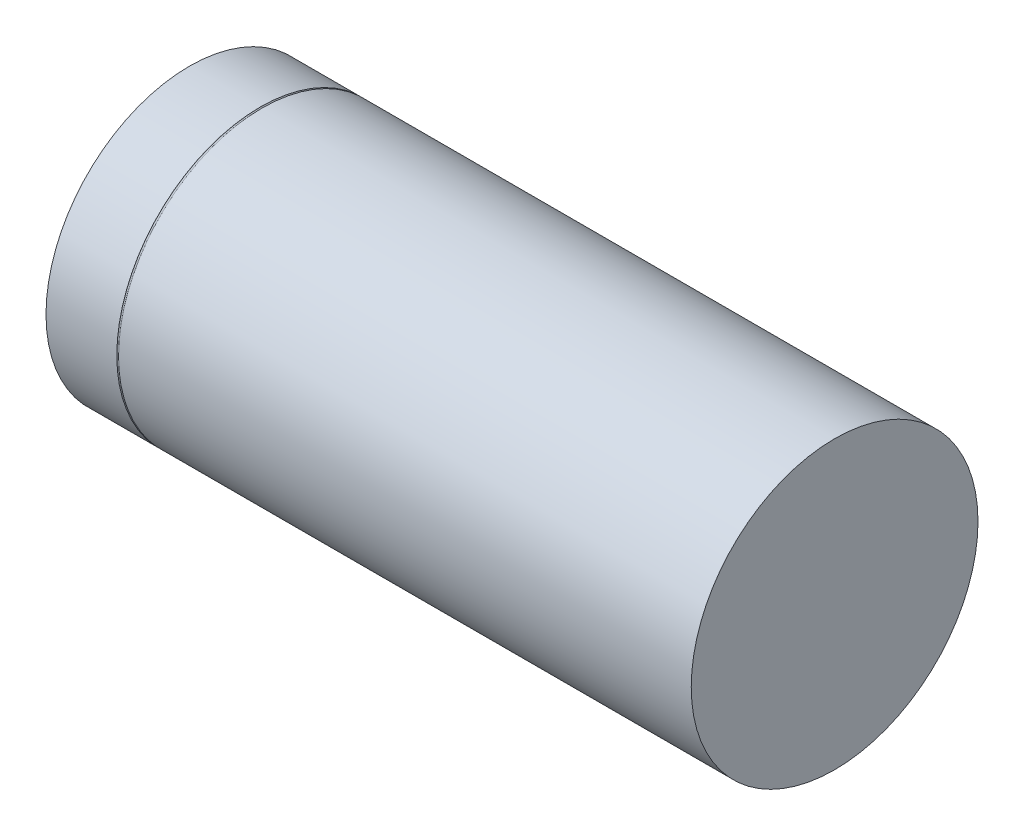
ISO-10303-21;
HEADER;
FILE_DESCRIPTION(('STEP AP214'),'2;1');
FILE_NAME('part.step','',(''),(''),'','','');
FILE_SCHEMA(('AUTOMOTIVE_DESIGN { 1 0 10303 214 1 1 1 1 }'));
ENDSEC;
DATA;
#1=APPLICATION_CONTEXT('core data for automotive mechanical design processes');
#2=APPLICATION_PROTOCOL_DEFINITION('international standard','automotive_design',2000,#1);
#3=PRODUCT_CONTEXT('',#1,'mechanical');
#4=PRODUCT('Part','Part','',(#3));
#5=PRODUCT_RELATED_PRODUCT_CATEGORY('part','',(#4));
#6=PRODUCT_DEFINITION_FORMATION('','',#4);
#7=PRODUCT_DEFINITION_CONTEXT('part definition',#1,'design');
#8=PRODUCT_DEFINITION('design','',#6,#7);
#9=PRODUCT_DEFINITION_SHAPE('','',#8);
#10=(LENGTH_UNIT() NAMED_UNIT(*) SI_UNIT(.MILLI.,.METRE.));
#11=(NAMED_UNIT(*) PLANE_ANGLE_UNIT() SI_UNIT($,.RADIAN.));
#12=(NAMED_UNIT(*) SI_UNIT($,.STERADIAN.) SOLID_ANGLE_UNIT());
#13=UNCERTAINTY_MEASURE_WITH_UNIT(LENGTH_MEASURE(1.E-05),#10,'distance_accuracy_value','');
#14=(GEOMETRIC_REPRESENTATION_CONTEXT(3) GLOBAL_UNCERTAINTY_ASSIGNED_CONTEXT((#13)) GLOBAL_UNIT_ASSIGNED_CONTEXT((#10,
#11,#12)) REPRESENTATION_CONTEXT('',''));
#15=CARTESIAN_POINT('',(0.,0.,0.));
#16=DIRECTION('',(0.,0.,1.));
#17=DIRECTION('',(1.,0.,0.));
#18=AXIS2_PLACEMENT_3D('',#15,#16,#17);
#19=CARTESIAN_POINT('',(72.,0.,0.));
#20=DIRECTION('',(-1.,0.,0.));
#21=DIRECTION('',(0.,0.,1.));
#22=AXIS2_PLACEMENT_3D('',#19,#20,#21);
#23=CYLINDRICAL_SURFACE('',#22,16.);
#24=CARTESIAN_POINT('',(8.09999999999999,0.,0.));
#25=DIRECTION('',(-1.,0.,0.));
#26=DIRECTION('',(0.,0.,1.));
#27=AXIS2_PLACEMENT_3D('',#24,#25,#26);
#28=CIRCLE('',#27,16.);
#29=CARTESIAN_POINT('',(8.09999999999999,0.,16.));
#30=VERTEX_POINT('',#29);
#31=EDGE_CURVE('E37',#30,#30,#28,.F.);
#32=ORIENTED_EDGE('',*,*,#31,.T.);
#33=EDGE_LOOP('',(#32));
#34=FACE_BOUND('',#33,.T.);
#35=CARTESIAN_POINT('',(72.,0.,0.));
#36=DIRECTION('',(1.,0.,0.));
#37=DIRECTION('',(0.,0.,-1.));
#38=AXIS2_PLACEMENT_3D('',#35,#36,#37);
#39=CIRCLE('',#38,16.);
#40=CARTESIAN_POINT('',(72.,0.,-16.));
#41=VERTEX_POINT('',#40);
#42=EDGE_CURVE('E10',#41,#41,#39,.T.);
#43=ORIENTED_EDGE('',*,*,#42,.F.);
#44=EDGE_LOOP('',(#43));
#45=FACE_BOUND('',#44,.T.);
#46=ADVANCED_FACE('F33',(#34,#45),#23,.T.);
#47=CARTESIAN_POINT('',(72.,0.,0.));
#48=DIRECTION('',(1.,0.,0.));
#49=DIRECTION('',(0.,0.,-1.));
#50=AXIS2_PLACEMENT_3D('',#47,#48,#49);
#51=PLANE('',#50);
#52=ORIENTED_EDGE('',*,*,#42,.T.);
#53=EDGE_LOOP('',(#52));
#54=FACE_BOUND('',#53,.T.);
#55=ADVANCED_FACE('F59',(#54),#51,.T.);
#56=CARTESIAN_POINT('',(7.99999999999999,0.,0.));
#57=DIRECTION('',(1.,0.,0.));
#58=DIRECTION('',(0.,0.,-1.));
#59=AXIS2_PLACEMENT_3D('',#56,#57,#58);
#60=TOROIDAL_SURFACE('',#59,16.,0.0999999999999993);
#61=CARTESIAN_POINT('',(7.89999999999999,0.,0.));
#62=DIRECTION('',(1.,0.,0.));
#63=DIRECTION('',(0.,0.,-1.));
#64=AXIS2_PLACEMENT_3D('',#61,#62,#63);
#65=CIRCLE('',#64,16.);
#66=CARTESIAN_POINT('',(7.89999999999999,0.,-16.));
#67=VERTEX_POINT('',#66);
#68=EDGE_CURVE('E47',#67,#67,#65,.F.);
#69=ORIENTED_EDGE('',*,*,#68,.F.);
#70=EDGE_LOOP('',(#69));
#71=FACE_BOUND('',#70,.T.);
#72=ORIENTED_EDGE('',*,*,#31,.F.);
#73=EDGE_LOOP('',(#72));
#74=FACE_BOUND('',#73,.T.);
#75=ADVANCED_FACE('F56',(#71,#74),#60,.F.);
#76=CARTESIAN_POINT('',(0.,0.,0.));
#77=DIRECTION('',(1.,0.,0.));
#78=DIRECTION('',(0.,0.,-1.));
#79=AXIS2_PLACEMENT_3D('',#76,#77,#78);
#80=PLANE('',#79);
#81=CARTESIAN_POINT('',(0.,0.,0.));
#82=DIRECTION('',(1.,0.,0.));
#83=DIRECTION('',(0.,0.,-1.));
#84=AXIS2_PLACEMENT_3D('',#81,#82,#83);
#85=CIRCLE('',#84,16.);
#86=CARTESIAN_POINT('',(0.,0.,-16.));
#87=VERTEX_POINT('',#86);
#88=EDGE_CURVE('E41',#87,#87,#85,.T.);
#89=ORIENTED_EDGE('',*,*,#88,.F.);
#90=EDGE_LOOP('',(#89));
#91=FACE_BOUND('',#90,.T.);
#92=ADVANCED_FACE('F58',(#91),#80,.F.);
#93=ORIENTED_EDGE('',*,*,#68,.T.);
#94=EDGE_LOOP('',(#93));
#95=FACE_BOUND('',#94,.T.);
#96=ORIENTED_EDGE('',*,*,#88,.T.);
#97=EDGE_LOOP('',(#96));
#98=FACE_BOUND('',#97,.T.);
#99=ADVANCED_FACE('F35',(#95,#98),#23,.T.);
#100=CLOSED_SHELL('',(#46,#55,#75,#92,#99));
#101=MANIFOLD_SOLID_BREP('B2',#100);
#102=ADVANCED_BREP_SHAPE_REPRESENTATION('',(#18,#101),#14);
#103=SHAPE_DEFINITION_REPRESENTATION(#9,#102);
ENDSEC;
END-ISO-10303-21;
